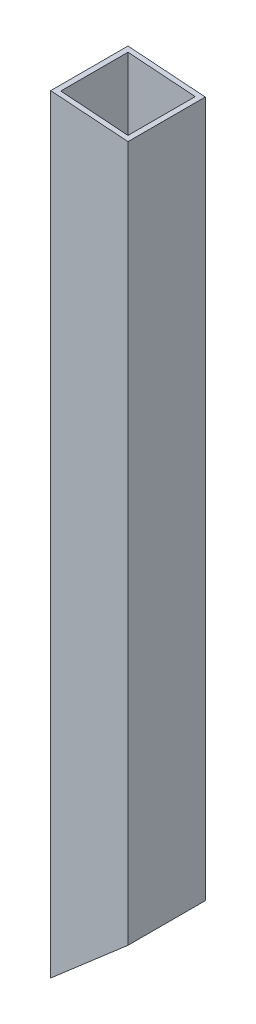
ISO-10303-21;
HEADER;
FILE_DESCRIPTION(('STEP AP214'),'2;1');
FILE_NAME('part.step','',(''),(''),'','','');
FILE_SCHEMA(('AUTOMOTIVE_DESIGN { 1 0 10303 214 1 1 1 1 }'));
ENDSEC;
DATA;
#1=APPLICATION_CONTEXT('core data for automotive mechanical design processes');
#2=APPLICATION_PROTOCOL_DEFINITION('international standard','automotive_design',2000,#1);
#3=PRODUCT_CONTEXT('',#1,'mechanical');
#4=PRODUCT('Part','Part','',(#3));
#5=PRODUCT_RELATED_PRODUCT_CATEGORY('part','',(#4));
#6=PRODUCT_DEFINITION_FORMATION('','',#4);
#7=PRODUCT_DEFINITION_CONTEXT('part definition',#1,'design');
#8=PRODUCT_DEFINITION('design','',#6,#7);
#9=PRODUCT_DEFINITION_SHAPE('','',#8);
#10=(LENGTH_UNIT() NAMED_UNIT(*) SI_UNIT(.MILLI.,.METRE.));
#11=(NAMED_UNIT(*) PLANE_ANGLE_UNIT() SI_UNIT($,.RADIAN.));
#12=(NAMED_UNIT(*) SI_UNIT($,.STERADIAN.) SOLID_ANGLE_UNIT());
#13=UNCERTAINTY_MEASURE_WITH_UNIT(LENGTH_MEASURE(1.E-05),#10,'distance_accuracy_value','');
#14=(GEOMETRIC_REPRESENTATION_CONTEXT(3) GLOBAL_UNCERTAINTY_ASSIGNED_CONTEXT((#13)) GLOBAL_UNIT_ASSIGNED_CONTEXT((#10,
#11,#12)) REPRESENTATION_CONTEXT('',''));
#15=CARTESIAN_POINT('',(0.,0.,0.));
#16=DIRECTION('',(0.,0.,1.));
#17=DIRECTION('',(1.,0.,0.));
#18=AXIS2_PLACEMENT_3D('',#15,#16,#17);
#19=CARTESIAN_POINT('',(25.4,250.759583461064,-25.4));
#20=DIRECTION('',(-0.0714475105128616,-0.997444360975345,0.));
#21=DIRECTION('',(0.997444360975345,-0.0714475105128616,0.));
#22=AXIS2_PLACEMENT_3D('',#19,#20,#21);
#23=PLANE('',#22);
#24=DIRECTION('',(0.997444360975345,-0.0714475105128617,0.));
#25=VECTOR('',#24,1.);
#26=CARTESIAN_POINT('',(25.4,250.759583461064,0.));
#27=LINE('',#26,#25);
#28=CARTESIAN_POINT('',(0.,252.579,0.));
#29=VERTEX_POINT('',#28);
#30=CARTESIAN_POINT('',(25.4,250.759583461064,0.));
#31=VERTEX_POINT('',#30);
#32=EDGE_CURVE('E141',#29,#31,#27,.T.);
#33=ORIENTED_EDGE('',*,*,#32,.T.);
#34=DIRECTION('',(0.,0.,1.));
#35=VECTOR('',#34,1.);
#36=CARTESIAN_POINT('',(25.4,250.759583461064,-25.4));
#37=LINE('',#36,#35);
#38=CARTESIAN_POINT('',(25.4,250.759583461064,-25.4));
#39=VERTEX_POINT('',#38);
#40=EDGE_CURVE('E145',#39,#31,#37,.T.);
#41=ORIENTED_EDGE('',*,*,#40,.F.);
#42=DIRECTION('',(0.997444360975345,-0.0714475105128617,0.));
#43=VECTOR('',#42,1.);
#44=CARTESIAN_POINT('',(25.4,250.759583461064,-25.4));
#45=LINE('',#44,#43);
#46=CARTESIAN_POINT('',(0.,252.579,-25.4));
#47=VERTEX_POINT('',#46);
#48=EDGE_CURVE('E142',#47,#39,#45,.T.);
#49=ORIENTED_EDGE('',*,*,#48,.F.);
#50=DIRECTION('',(0.,0.,1.));
#51=VECTOR('',#50,1.);
#52=CARTESIAN_POINT('',(0.,252.579,0.));
#53=LINE('',#52,#51);
#54=EDGE_CURVE('E150',#47,#29,#53,.T.);
#55=ORIENTED_EDGE('',*,*,#54,.T.);
#56=EDGE_LOOP('',(#33,#41,#49,#55));
#57=FACE_BOUND('',#56,.T.);
#58=DIRECTION('',(0.997444360975345,-0.0714475105128616,0.));
#59=VECTOR('',#58,1.);
#60=CARTESIAN_POINT('',(25.4,250.759583461064,-1.651));
#61=LINE('',#60,#59);
#62=CARTESIAN_POINT('',(1.651,252.460737924969,-1.651));
#63=VERTEX_POINT('',#62);
#64=CARTESIAN_POINT('',(23.749,250.877845536095,-1.651));
#65=VERTEX_POINT('',#64);
#66=EDGE_CURVE('E124',#63,#65,#61,.T.);
#67=ORIENTED_EDGE('',*,*,#66,.F.);
#68=DIRECTION('',(0.,0.,1.));
#69=VECTOR('',#68,1.);
#70=CARTESIAN_POINT('',(1.651,252.460737924969,-25.4));
#71=LINE('',#70,#69);
#72=CARTESIAN_POINT('',(1.651,252.460737924969,-23.749));
#73=VERTEX_POINT('',#72);
#74=EDGE_CURVE('E109',#73,#63,#71,.T.);
#75=ORIENTED_EDGE('',*,*,#74,.F.);
#76=DIRECTION('',(0.997444360975345,-0.0714475105128616,0.));
#77=VECTOR('',#76,1.);
#78=CARTESIAN_POINT('',(0.,252.579,-23.749));
#79=LINE('',#78,#77);
#80=CARTESIAN_POINT('',(23.749,250.877845536095,-23.749));
#81=VERTEX_POINT('',#80);
#82=EDGE_CURVE('E117',#73,#81,#79,.T.);
#83=ORIENTED_EDGE('',*,*,#82,.T.);
#84=DIRECTION('',(0.,0.,1.));
#85=VECTOR('',#84,1.);
#86=CARTESIAN_POINT('',(23.749,250.877845536095,0.));
#87=LINE('',#86,#85);
#88=EDGE_CURVE('E110',#81,#65,#87,.T.);
#89=ORIENTED_EDGE('',*,*,#88,.T.);
#90=EDGE_LOOP('',(#67,#75,#83,#89));
#91=FACE_BOUND('',#90,.T.);
#92=ADVANCED_FACE('F38',(#57,#91),#23,.F.);
#93=CARTESIAN_POINT('',(0.,0.,-25.4));
#94=DIRECTION('',(-0.654778652319414,0.755820690684485,0.));
#95=DIRECTION('',(-0.755820690684485,-0.654778652319414,0.));
#96=AXIS2_PLACEMENT_3D('',#93,#94,#95);
#97=PLANE('',#96);
#98=DIRECTION('',(-0.755820690684485,-0.654778652319414,0.));
#99=VECTOR('',#98,1.);
#100=CARTESIAN_POINT('',(0.,0.,0.));
#101=LINE('',#100,#99);
#102=CARTESIAN_POINT('',(25.4,22.004395981607,0.));
#103=VERTEX_POINT('',#102);
#104=CARTESIAN_POINT('',(0.,0.,0.));
#105=VERTEX_POINT('',#104);
#106=EDGE_CURVE('E138',#103,#105,#101,.T.);
#107=ORIENTED_EDGE('',*,*,#106,.T.);
#108=DIRECTION('',(0.,0.,1.));
#109=VECTOR('',#108,1.);
#110=CARTESIAN_POINT('',(0.,0.,0.));
#111=LINE('',#110,#109);
#112=CARTESIAN_POINT('',(0.,0.,-25.4));
#113=VERTEX_POINT('',#112);
#114=EDGE_CURVE('E149',#113,#105,#111,.T.);
#115=ORIENTED_EDGE('',*,*,#114,.F.);
#116=DIRECTION('',(-0.755820690684485,-0.654778652319414,0.));
#117=VECTOR('',#116,1.);
#118=CARTESIAN_POINT('',(0.,0.,-25.4));
#119=LINE('',#118,#117);
#120=CARTESIAN_POINT('',(25.4,22.004395981607,-25.4));
#121=VERTEX_POINT('',#120);
#122=EDGE_CURVE('E134',#121,#113,#119,.T.);
#123=ORIENTED_EDGE('',*,*,#122,.F.);
#124=DIRECTION('',(0.,0.,1.));
#125=VECTOR('',#124,1.);
#126=CARTESIAN_POINT('',(25.4,22.004395981607,-25.4));
#127=LINE('',#126,#125);
#128=EDGE_CURVE('E137',#121,#103,#127,.T.);
#129=ORIENTED_EDGE('',*,*,#128,.T.);
#130=EDGE_LOOP('',(#107,#115,#123,#129));
#131=FACE_BOUND('',#130,.T.);
#132=DIRECTION('',(-0.755820690684485,-0.654778652319414,0.));
#133=VECTOR('',#132,1.);
#134=CARTESIAN_POINT('',(0.,0.,-1.651));
#135=LINE('',#134,#133);
#136=CARTESIAN_POINT('',(23.749,20.5741102428026,-1.651));
#137=VERTEX_POINT('',#136);
#138=CARTESIAN_POINT('',(1.651,1.43028573880446,-1.651));
#139=VERTEX_POINT('',#138);
#140=EDGE_CURVE('E122',#137,#139,#135,.T.);
#141=ORIENTED_EDGE('',*,*,#140,.F.);
#142=DIRECTION('',(0.,0.,1.));
#143=VECTOR('',#142,1.);
#144=CARTESIAN_POINT('',(23.749,20.5741102428026,-25.4));
#145=LINE('',#144,#143);
#146=CARTESIAN_POINT('',(23.749,20.5741102428026,-23.749));
#147=VERTEX_POINT('',#146);
#148=EDGE_CURVE('E121',#147,#137,#145,.T.);
#149=ORIENTED_EDGE('',*,*,#148,.F.);
#150=DIRECTION('',(-0.755820690684485,-0.654778652319414,0.));
#151=VECTOR('',#150,1.);
#152=CARTESIAN_POINT('',(125.000148168489,108.289478663739,-23.749));
#153=LINE('',#152,#151);
#154=CARTESIAN_POINT('',(1.651,1.43028573880446,-23.749));
#155=VERTEX_POINT('',#154);
#156=EDGE_CURVE('E114',#147,#155,#153,.T.);
#157=ORIENTED_EDGE('',*,*,#156,.T.);
#158=DIRECTION('',(0.,0.,1.));
#159=VECTOR('',#158,1.);
#160=CARTESIAN_POINT('',(1.651,1.43028573880449,0.));
#161=LINE('',#160,#159);
#162=EDGE_CURVE('E102',#155,#139,#161,.T.);
#163=ORIENTED_EDGE('',*,*,#162,.T.);
#164=EDGE_LOOP('',(#141,#149,#157,#163));
#165=FACE_BOUND('',#164,.T.);
#166=ADVANCED_FACE('F120',(#131,#165),#97,.F.);
#167=CARTESIAN_POINT('',(0.,252.579,0.));
#168=DIRECTION('',(1.,0.,0.));
#169=DIRECTION('',(0.,0.,-1.));
#170=AXIS2_PLACEMENT_3D('',#167,#168,#169);
#171=PLANE('',#170);
#172=ORIENTED_EDGE('',*,*,#114,.T.);
#173=DIRECTION('',(0.,-1.,0.));
#174=VECTOR('',#173,1.);
#175=CARTESIAN_POINT('',(0.,252.579,0.));
#176=LINE('',#175,#174);
#177=EDGE_CURVE('E11',#29,#105,#176,.T.);
#178=ORIENTED_EDGE('',*,*,#177,.F.);
#179=ORIENTED_EDGE('',*,*,#54,.F.);
#180=DIRECTION('',(0.,-1.,0.));
#181=VECTOR('',#180,1.);
#182=CARTESIAN_POINT('',(0.,252.579,-25.4));
#183=LINE('',#182,#181);
#184=EDGE_CURVE('E152',#47,#113,#183,.T.);
#185=ORIENTED_EDGE('',*,*,#184,.T.);
#186=EDGE_LOOP('',(#172,#178,#179,#185));
#187=FACE_BOUND('',#186,.T.);
#188=ADVANCED_FACE('F40',(#187),#171,.F.);
#189=CARTESIAN_POINT('',(0.,252.579,0.));
#190=DIRECTION('',(0.,0.,-1.));
#191=DIRECTION('',(-1.,0.,0.));
#192=AXIS2_PLACEMENT_3D('',#189,#190,#191);
#193=PLANE('',#192);
#194=ORIENTED_EDGE('',*,*,#177,.T.);
#195=ORIENTED_EDGE('',*,*,#106,.F.);
#196=DIRECTION('',(0.,-1.,0.));
#197=VECTOR('',#196,1.);
#198=CARTESIAN_POINT('',(25.4,252.579,0.));
#199=LINE('',#198,#197);
#200=EDGE_CURVE('E46',#31,#103,#199,.T.);
#201=ORIENTED_EDGE('',*,*,#200,.F.);
#202=ORIENTED_EDGE('',*,*,#32,.F.);
#203=EDGE_LOOP('',(#194,#195,#201,#202));
#204=FACE_BOUND('',#203,.T.);
#205=ADVANCED_FACE('F168',(#204),#193,.F.);
#206=CARTESIAN_POINT('',(25.4,252.579,0.));
#207=DIRECTION('',(-1.,0.,0.));
#208=DIRECTION('',(0.,0.,1.));
#209=AXIS2_PLACEMENT_3D('',#206,#207,#208);
#210=PLANE('',#209);
#211=ORIENTED_EDGE('',*,*,#200,.T.);
#212=ORIENTED_EDGE('',*,*,#128,.F.);
#213=DIRECTION('',(0.,-1.,0.));
#214=VECTOR('',#213,1.);
#215=CARTESIAN_POINT('',(25.4,252.579,-25.4));
#216=LINE('',#215,#214);
#217=EDGE_CURVE('E157',#39,#121,#216,.T.);
#218=ORIENTED_EDGE('',*,*,#217,.F.);
#219=ORIENTED_EDGE('',*,*,#40,.T.);
#220=EDGE_LOOP('',(#211,#212,#218,#219));
#221=FACE_BOUND('',#220,.T.);
#222=ADVANCED_FACE('F163',(#221),#210,.F.);
#223=CARTESIAN_POINT('',(0.,252.579,-25.4));
#224=DIRECTION('',(0.,0.,1.));
#225=DIRECTION('',(1.,0.,0.));
#226=AXIS2_PLACEMENT_3D('',#223,#224,#225);
#227=PLANE('',#226);
#228=ORIENTED_EDGE('',*,*,#217,.T.);
#229=ORIENTED_EDGE('',*,*,#122,.T.);
#230=ORIENTED_EDGE('',*,*,#184,.F.);
#231=ORIENTED_EDGE('',*,*,#48,.T.);
#232=EDGE_LOOP('',(#228,#229,#230,#231));
#233=FACE_BOUND('',#232,.T.);
#234=ADVANCED_FACE('F173',(#233),#227,.F.);
#235=CARTESIAN_POINT('',(1.651,252.579,0.));
#236=DIRECTION('',(1.,0.,0.));
#237=DIRECTION('',(0.,0.,-1.));
#238=AXIS2_PLACEMENT_3D('',#235,#236,#237);
#239=PLANE('',#238);
#240=ORIENTED_EDGE('',*,*,#162,.F.);
#241=DIRECTION('',(0.,-1.,0.));
#242=VECTOR('',#241,1.);
#243=CARTESIAN_POINT('',(1.651,252.579,-23.749));
#244=LINE('',#243,#242);
#245=EDGE_CURVE('E53',#73,#155,#244,.T.);
#246=ORIENTED_EDGE('',*,*,#245,.F.);
#247=ORIENTED_EDGE('',*,*,#74,.T.);
#248=DIRECTION('',(0.,-1.,0.));
#249=VECTOR('',#248,1.);
#250=CARTESIAN_POINT('',(1.651,252.579,-1.651));
#251=LINE('',#250,#249);
#252=EDGE_CURVE('E105',#63,#139,#251,.T.);
#253=ORIENTED_EDGE('',*,*,#252,.T.);
#254=EDGE_LOOP('',(#240,#246,#247,#253));
#255=FACE_BOUND('',#254,.T.);
#256=ADVANCED_FACE('F103',(#255),#239,.T.);
#257=CARTESIAN_POINT('',(0.,252.579,-1.651));
#258=DIRECTION('',(0.,0.,-1.));
#259=DIRECTION('',(-1.,0.,0.));
#260=AXIS2_PLACEMENT_3D('',#257,#258,#259);
#261=PLANE('',#260);
#262=ORIENTED_EDGE('',*,*,#252,.F.);
#263=ORIENTED_EDGE('',*,*,#66,.T.);
#264=DIRECTION('',(0.,-1.,0.));
#265=VECTOR('',#264,1.);
#266=CARTESIAN_POINT('',(23.749,252.579,-1.651));
#267=LINE('',#266,#265);
#268=EDGE_CURVE('E185',#65,#137,#267,.T.);
#269=ORIENTED_EDGE('',*,*,#268,.T.);
#270=ORIENTED_EDGE('',*,*,#140,.T.);
#271=EDGE_LOOP('',(#262,#263,#269,#270));
#272=FACE_BOUND('',#271,.T.);
#273=ADVANCED_FACE('F184',(#272),#261,.T.);
#274=CARTESIAN_POINT('',(23.749,252.579,0.));
#275=DIRECTION('',(-1.,0.,0.));
#276=DIRECTION('',(0.,0.,1.));
#277=AXIS2_PLACEMENT_3D('',#274,#275,#276);
#278=PLANE('',#277);
#279=ORIENTED_EDGE('',*,*,#268,.F.);
#280=ORIENTED_EDGE('',*,*,#88,.F.);
#281=DIRECTION('',(0.,-1.,0.));
#282=VECTOR('',#281,1.);
#283=CARTESIAN_POINT('',(23.749,252.579,-23.749));
#284=LINE('',#283,#282);
#285=EDGE_CURVE('E61',#81,#147,#284,.T.);
#286=ORIENTED_EDGE('',*,*,#285,.T.);
#287=ORIENTED_EDGE('',*,*,#148,.T.);
#288=EDGE_LOOP('',(#279,#280,#286,#287));
#289=FACE_BOUND('',#288,.T.);
#290=ADVANCED_FACE('F186',(#289),#278,.T.);
#291=CARTESIAN_POINT('',(0.,252.579,-23.749));
#292=DIRECTION('',(0.,0.,1.));
#293=DIRECTION('',(1.,0.,0.));
#294=AXIS2_PLACEMENT_3D('',#291,#292,#293);
#295=PLANE('',#294);
#296=ORIENTED_EDGE('',*,*,#285,.F.);
#297=ORIENTED_EDGE('',*,*,#82,.F.);
#298=ORIENTED_EDGE('',*,*,#245,.T.);
#299=ORIENTED_EDGE('',*,*,#156,.F.);
#300=EDGE_LOOP('',(#296,#297,#298,#299));
#301=FACE_BOUND('',#300,.T.);
#302=ADVANCED_FACE('F113',(#301),#295,.T.);
#303=CLOSED_SHELL('',(#92,#166,#188,#205,#222,#234,#256,#273,#290,#302));
#304=MANIFOLD_SOLID_BREP('B2',#303);
#305=ADVANCED_BREP_SHAPE_REPRESENTATION('',(#18,#304),#14);
#306=SHAPE_DEFINITION_REPRESENTATION(#9,#305);
ENDSEC;
END-ISO-10303-21;
